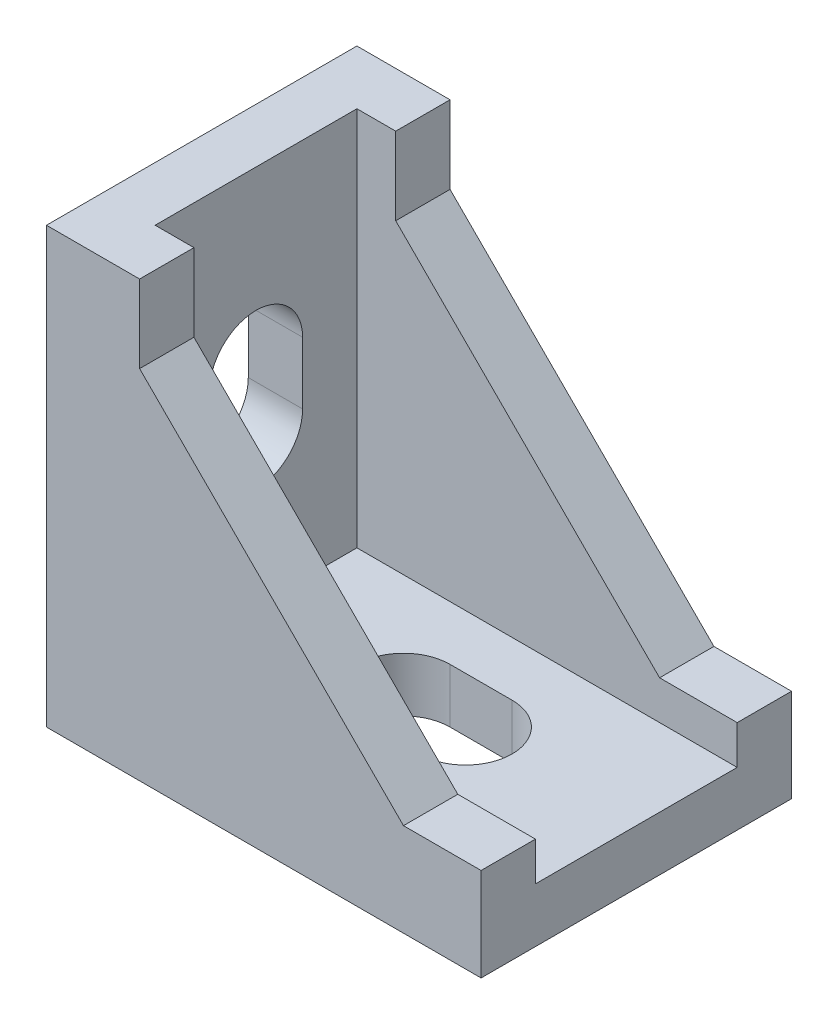
ISO-10303-21;
HEADER;
FILE_DESCRIPTION(('STEP AP214'),'2;1');
FILE_NAME('part.step','',(''),(''),'','','');
FILE_SCHEMA(('AUTOMOTIVE_DESIGN { 1 0 10303 214 1 1 1 1 }'));
ENDSEC;
DATA;
#1=APPLICATION_CONTEXT('core data for automotive mechanical design processes');
#2=APPLICATION_PROTOCOL_DEFINITION('international standard','automotive_design',2000,#1);
#3=PRODUCT_CONTEXT('',#1,'mechanical');
#4=PRODUCT('Part','Part','',(#3));
#5=PRODUCT_RELATED_PRODUCT_CATEGORY('part','',(#4));
#6=PRODUCT_DEFINITION_FORMATION('','',#4);
#7=PRODUCT_DEFINITION_CONTEXT('part definition',#1,'design');
#8=PRODUCT_DEFINITION('design','',#6,#7);
#9=PRODUCT_DEFINITION_SHAPE('','',#8);
#10=(LENGTH_UNIT() NAMED_UNIT(*) SI_UNIT(.MILLI.,.METRE.));
#11=(NAMED_UNIT(*) PLANE_ANGLE_UNIT() SI_UNIT($,.RADIAN.));
#12=(NAMED_UNIT(*) SI_UNIT($,.STERADIAN.) SOLID_ANGLE_UNIT());
#13=UNCERTAINTY_MEASURE_WITH_UNIT(LENGTH_MEASURE(1.E-05),#10,'distance_accuracy_value','');
#14=(GEOMETRIC_REPRESENTATION_CONTEXT(3) GLOBAL_UNCERTAINTY_ASSIGNED_CONTEXT((#13)) GLOBAL_UNIT_ASSIGNED_CONTEXT((#10,
#11,#12)) REPRESENTATION_CONTEXT('',''));
#15=CARTESIAN_POINT('',(0.,0.,0.));
#16=DIRECTION('',(0.,0.,1.));
#17=DIRECTION('',(1.,0.,0.));
#18=AXIS2_PLACEMENT_3D('',#15,#16,#17);
#19=CARTESIAN_POINT('',(3.5,28.,10.));
#20=DIRECTION('',(0.,-1.,0.));
#21=DIRECTION('',(0.,0.,-1.));
#22=AXIS2_PLACEMENT_3D('',#19,#20,#21);
#23=PLANE('',#22);
#24=DIRECTION('',(-1.,0.,0.));
#25=VECTOR('',#24,1.);
#26=CARTESIAN_POINT('',(3.5,28.,-10.));
#27=LINE('',#26,#25);
#28=CARTESIAN_POINT('',(6.,28.,-10.));
#29=VERTEX_POINT('',#28);
#30=CARTESIAN_POINT('',(0.,28.,-10.));
#31=VERTEX_POINT('',#30);
#32=EDGE_CURVE('E323',#29,#31,#27,.T.);
#33=ORIENTED_EDGE('',*,*,#32,.T.);
#34=DIRECTION('',(0.,0.,-1.));
#35=VECTOR('',#34,1.);
#36=CARTESIAN_POINT('',(0.,28.,10.));
#37=LINE('',#36,#35);
#38=CARTESIAN_POINT('',(0.,28.,10.));
#39=VERTEX_POINT('',#38);
#40=EDGE_CURVE('E12',#39,#31,#37,.T.);
#41=ORIENTED_EDGE('',*,*,#40,.F.);
#42=DIRECTION('',(-1.,0.,0.));
#43=VECTOR('',#42,1.);
#44=CARTESIAN_POINT('',(3.5,28.,10.));
#45=LINE('',#44,#43);
#46=CARTESIAN_POINT('',(6.,28.,10.));
#47=VERTEX_POINT('',#46);
#48=EDGE_CURVE('E330',#47,#39,#45,.T.);
#49=ORIENTED_EDGE('',*,*,#48,.F.);
#50=DIRECTION('',(0.,0.,1.));
#51=VECTOR('',#50,1.);
#52=CARTESIAN_POINT('',(6.,28.,6.5));
#53=LINE('',#52,#51);
#54=CARTESIAN_POINT('',(6.,28.,6.5));
#55=VERTEX_POINT('',#54);
#56=EDGE_CURVE('E320',#55,#47,#53,.T.);
#57=ORIENTED_EDGE('',*,*,#56,.F.);
#58=DIRECTION('',(-1.,0.,0.));
#59=VECTOR('',#58,1.);
#60=CARTESIAN_POINT('',(3.5,28.,6.5));
#61=LINE('',#60,#59);
#62=CARTESIAN_POINT('',(3.5,28.,6.5));
#63=VERTEX_POINT('',#62);
#64=EDGE_CURVE('E309',#55,#63,#61,.T.);
#65=ORIENTED_EDGE('',*,*,#64,.T.);
#66=DIRECTION('',(0.,0.,-1.));
#67=VECTOR('',#66,1.);
#68=CARTESIAN_POINT('',(3.5,28.,10.));
#69=LINE('',#68,#67);
#70=CARTESIAN_POINT('',(3.5,28.,-6.5));
#71=VERTEX_POINT('',#70);
#72=EDGE_CURVE('E340',#63,#71,#69,.T.);
#73=ORIENTED_EDGE('',*,*,#72,.T.);
#74=DIRECTION('',(-1.,0.,0.));
#75=VECTOR('',#74,1.);
#76=CARTESIAN_POINT('',(3.5,28.,-6.5));
#77=LINE('',#76,#75);
#78=CARTESIAN_POINT('',(6.,28.,-6.5));
#79=VERTEX_POINT('',#78);
#80=EDGE_CURVE('E257',#79,#71,#77,.T.);
#81=ORIENTED_EDGE('',*,*,#80,.F.);
#82=DIRECTION('',(0.,0.,-1.));
#83=VECTOR('',#82,1.);
#84=CARTESIAN_POINT('',(6.,28.,-6.5));
#85=LINE('',#84,#83);
#86=EDGE_CURVE('E272',#79,#29,#85,.T.);
#87=ORIENTED_EDGE('',*,*,#86,.T.);
#88=EDGE_LOOP('',(#33,#41,#49,#57,#65,#73,#81,#87));
#89=FACE_BOUND('',#88,.T.);
#90=ADVANCED_FACE('F38',(#89),#23,.F.);
#91=CARTESIAN_POINT('',(0.,28.,10.));
#92=DIRECTION('',(1.,0.,0.));
#93=DIRECTION('',(0.,1.,0.));
#94=AXIS2_PLACEMENT_3D('',#91,#92,#93);
#95=PLANE('',#94);
#96=DIRECTION('',(0.,1.,0.));
#97=VECTOR('',#96,1.);
#98=CARTESIAN_POINT('',(0.,13.,3.));
#99=LINE('',#98,#97);
#100=CARTESIAN_POINT('',(0.,13.,3.));
#101=VERTEX_POINT('',#100);
#102=CARTESIAN_POINT('',(0.,17.,3.));
#103=VERTEX_POINT('',#102);
#104=EDGE_CURVE('E206',#101,#103,#99,.T.);
#105=ORIENTED_EDGE('',*,*,#104,.F.);
#106=CARTESIAN_POINT('',(0.,13.,0.));
#107=DIRECTION('',(1.,0.,0.));
#108=DIRECTION('',(0.,1.,0.));
#109=AXIS2_PLACEMENT_3D('',#106,#107,#108);
#110=CIRCLE('',#109,3.);
#111=CARTESIAN_POINT('',(0.,13.,-3.));
#112=VERTEX_POINT('',#111);
#113=EDGE_CURVE('E188',#112,#101,#110,.F.);
#114=ORIENTED_EDGE('',*,*,#113,.F.);
#115=DIRECTION('',(0.,-1.,0.));
#116=VECTOR('',#115,1.);
#117=CARTESIAN_POINT('',(0.,13.,-3.));
#118=LINE('',#117,#116);
#119=CARTESIAN_POINT('',(0.,17.,-3.));
#120=VERTEX_POINT('',#119);
#121=EDGE_CURVE('E197',#120,#112,#118,.T.);
#122=ORIENTED_EDGE('',*,*,#121,.F.);
#123=CARTESIAN_POINT('',(0.,17.,0.));
#124=DIRECTION('',(1.,0.,0.));
#125=DIRECTION('',(0.,1.,0.));
#126=AXIS2_PLACEMENT_3D('',#123,#124,#125);
#127=CIRCLE('',#126,3.);
#128=EDGE_CURVE('E52',#103,#120,#127,.F.);
#129=ORIENTED_EDGE('',*,*,#128,.F.);
#130=EDGE_LOOP('',(#105,#114,#122,#129));
#131=FACE_BOUND('',#130,.T.);
#132=DIRECTION('',(0.,-1.,0.));
#133=VECTOR('',#132,1.);
#134=CARTESIAN_POINT('',(0.,28.,-10.));
#135=LINE('',#134,#133);
#136=CARTESIAN_POINT('',(0.,0.,-10.));
#137=VERTEX_POINT('',#136);
#138=EDGE_CURVE('E343',#31,#137,#135,.T.);
#139=ORIENTED_EDGE('',*,*,#138,.T.);
#140=DIRECTION('',(0.,0.,-1.));
#141=VECTOR('',#140,1.);
#142=CARTESIAN_POINT('',(0.,0.,10.));
#143=LINE('',#142,#141);
#144=CARTESIAN_POINT('',(0.,0.,10.));
#145=VERTEX_POINT('',#144);
#146=EDGE_CURVE('E45',#145,#137,#143,.T.);
#147=ORIENTED_EDGE('',*,*,#146,.F.);
#148=DIRECTION('',(0.,-1.,0.));
#149=VECTOR('',#148,1.);
#150=CARTESIAN_POINT('',(0.,28.,10.));
#151=LINE('',#150,#149);
#152=EDGE_CURVE('E333',#39,#145,#151,.T.);
#153=ORIENTED_EDGE('',*,*,#152,.F.);
#154=ORIENTED_EDGE('',*,*,#40,.T.);
#155=EDGE_LOOP('',(#139,#147,#153,#154));
#156=FACE_BOUND('',#155,.T.);
#157=ADVANCED_FACE('F203',(#131,#156),#95,.F.);
#158=CARTESIAN_POINT('',(0.,0.,10.));
#159=DIRECTION('',(0.,1.,0.));
#160=DIRECTION('',(0.,0.,1.));
#161=AXIS2_PLACEMENT_3D('',#158,#159,#160);
#162=PLANE('',#161);
#163=DIRECTION('',(1.,0.,0.));
#164=VECTOR('',#163,1.);
#165=CARTESIAN_POINT('',(13.,0.,-3.));
#166=LINE('',#165,#164);
#167=CARTESIAN_POINT('',(13.,0.,-3.));
#168=VERTEX_POINT('',#167);
#169=CARTESIAN_POINT('',(17.,0.,-3.));
#170=VERTEX_POINT('',#169);
#171=EDGE_CURVE('E224',#168,#170,#166,.T.);
#172=ORIENTED_EDGE('',*,*,#171,.F.);
#173=CARTESIAN_POINT('',(13.,0.,0.));
#174=DIRECTION('',(0.,1.,0.));
#175=DIRECTION('',(0.,0.,1.));
#176=AXIS2_PLACEMENT_3D('',#173,#174,#175);
#177=CIRCLE('',#176,3.);
#178=CARTESIAN_POINT('',(13.,0.,3.));
#179=VERTEX_POINT('',#178);
#180=EDGE_CURVE('E227',#179,#168,#177,.F.);
#181=ORIENTED_EDGE('',*,*,#180,.F.);
#182=DIRECTION('',(-1.,0.,0.));
#183=VECTOR('',#182,1.);
#184=CARTESIAN_POINT('',(13.,0.,3.));
#185=LINE('',#184,#183);
#186=CARTESIAN_POINT('',(17.,0.,3.));
#187=VERTEX_POINT('',#186);
#188=EDGE_CURVE('E244',#187,#179,#185,.T.);
#189=ORIENTED_EDGE('',*,*,#188,.F.);
#190=CARTESIAN_POINT('',(17.,0.,0.));
#191=DIRECTION('',(0.,1.,0.));
#192=DIRECTION('',(0.,0.,1.));
#193=AXIS2_PLACEMENT_3D('',#190,#191,#192);
#194=CIRCLE('',#193,3.);
#195=EDGE_CURVE('E200',#170,#187,#194,.F.);
#196=ORIENTED_EDGE('',*,*,#195,.F.);
#197=EDGE_LOOP('',(#172,#181,#189,#196));
#198=FACE_BOUND('',#197,.T.);
#199=DIRECTION('',(1.,0.,0.));
#200=VECTOR('',#199,1.);
#201=CARTESIAN_POINT('',(0.,0.,-10.));
#202=LINE('',#201,#200);
#203=CARTESIAN_POINT('',(28.,0.,-10.));
#204=VERTEX_POINT('',#203);
#205=EDGE_CURVE('E345',#137,#204,#202,.T.);
#206=ORIENTED_EDGE('',*,*,#205,.T.);
#207=DIRECTION('',(0.,0.,-1.));
#208=VECTOR('',#207,1.);
#209=CARTESIAN_POINT('',(28.,0.,10.));
#210=LINE('',#209,#208);
#211=CARTESIAN_POINT('',(28.,0.,10.));
#212=VERTEX_POINT('',#211);
#213=EDGE_CURVE('E355',#212,#204,#210,.T.);
#214=ORIENTED_EDGE('',*,*,#213,.F.);
#215=DIRECTION('',(1.,0.,0.));
#216=VECTOR('',#215,1.);
#217=CARTESIAN_POINT('',(0.,0.,10.));
#218=LINE('',#217,#216);
#219=EDGE_CURVE('E336',#145,#212,#218,.T.);
#220=ORIENTED_EDGE('',*,*,#219,.F.);
#221=ORIENTED_EDGE('',*,*,#146,.T.);
#222=EDGE_LOOP('',(#206,#214,#220,#221));
#223=FACE_BOUND('',#222,.T.);
#224=ADVANCED_FACE('F362',(#198,#223),#162,.F.);
#225=CARTESIAN_POINT('',(28.,0.,10.));
#226=DIRECTION('',(-1.,0.,0.));
#227=DIRECTION('',(0.,0.,1.));
#228=AXIS2_PLACEMENT_3D('',#225,#226,#227);
#229=PLANE('',#228);
#230=DIRECTION('',(0.,1.,0.));
#231=VECTOR('',#230,1.);
#232=CARTESIAN_POINT('',(28.,0.,-10.));
#233=LINE('',#232,#231);
#234=CARTESIAN_POINT('',(28.,6.,-10.));
#235=VERTEX_POINT('',#234);
#236=EDGE_CURVE('E334',#204,#235,#233,.T.);
#237=ORIENTED_EDGE('',*,*,#236,.T.);
#238=DIRECTION('',(0.,0.,-1.));
#239=VECTOR('',#238,1.);
#240=CARTESIAN_POINT('',(28.,6.,-6.5));
#241=LINE('',#240,#239);
#242=CARTESIAN_POINT('',(28.,6.,-6.5));
#243=VERTEX_POINT('',#242);
#244=EDGE_CURVE('E278',#243,#235,#241,.T.);
#245=ORIENTED_EDGE('',*,*,#244,.F.);
#246=DIRECTION('',(0.,1.,0.));
#247=VECTOR('',#246,1.);
#248=CARTESIAN_POINT('',(28.,6.,-6.5));
#249=LINE('',#248,#247);
#250=CARTESIAN_POINT('',(28.,3.5,-6.5));
#251=VERTEX_POINT('',#250);
#252=EDGE_CURVE('E267',#251,#243,#249,.T.);
#253=ORIENTED_EDGE('',*,*,#252,.F.);
#254=DIRECTION('',(0.,0.,-1.));
#255=VECTOR('',#254,1.);
#256=CARTESIAN_POINT('',(28.,3.5,10.));
#257=LINE('',#256,#255);
#258=CARTESIAN_POINT('',(28.,3.5,6.5));
#259=VERTEX_POINT('',#258);
#260=EDGE_CURVE('E353',#259,#251,#257,.T.);
#261=ORIENTED_EDGE('',*,*,#260,.F.);
#262=DIRECTION('',(0.,1.,0.));
#263=VECTOR('',#262,1.);
#264=CARTESIAN_POINT('',(28.,6.,6.5));
#265=LINE('',#264,#263);
#266=CARTESIAN_POINT('',(28.,6.,6.5));
#267=VERTEX_POINT('',#266);
#268=EDGE_CURVE('E297',#259,#267,#265,.T.);
#269=ORIENTED_EDGE('',*,*,#268,.T.);
#270=DIRECTION('',(0.,0.,1.));
#271=VECTOR('',#270,1.);
#272=CARTESIAN_POINT('',(28.,6.,6.5));
#273=LINE('',#272,#271);
#274=CARTESIAN_POINT('',(28.,6.,10.));
#275=VERTEX_POINT('',#274);
#276=EDGE_CURVE('E312',#267,#275,#273,.T.);
#277=ORIENTED_EDGE('',*,*,#276,.T.);
#278=DIRECTION('',(0.,1.,0.));
#279=VECTOR('',#278,1.);
#280=CARTESIAN_POINT('',(28.,0.,10.));
#281=LINE('',#280,#279);
#282=EDGE_CURVE('E338',#212,#275,#281,.T.);
#283=ORIENTED_EDGE('',*,*,#282,.F.);
#284=ORIENTED_EDGE('',*,*,#213,.T.);
#285=EDGE_LOOP('',(#237,#245,#253,#261,#269,#277,#283,#284));
#286=FACE_BOUND('',#285,.T.);
#287=ADVANCED_FACE('F371',(#286),#229,.F.);
#288=CARTESIAN_POINT('',(28.,3.5,10.));
#289=DIRECTION('',(0.,-1.,0.));
#290=DIRECTION('',(1.,0.,0.));
#291=AXIS2_PLACEMENT_3D('',#288,#289,#290);
#292=PLANE('',#291);
#293=DIRECTION('',(1.,0.,0.));
#294=VECTOR('',#293,1.);
#295=CARTESIAN_POINT('',(13.,3.5,3.));
#296=LINE('',#295,#294);
#297=CARTESIAN_POINT('',(13.,3.5,3.));
#298=VERTEX_POINT('',#297);
#299=CARTESIAN_POINT('',(17.,3.5,3.));
#300=VERTEX_POINT('',#299);
#301=EDGE_CURVE('E232',#298,#300,#296,.T.);
#302=ORIENTED_EDGE('',*,*,#301,.F.);
#303=CARTESIAN_POINT('',(13.,3.5,0.));
#304=DIRECTION('',(0.,1.,0.));
#305=DIRECTION('',(-1.,0.,0.));
#306=AXIS2_PLACEMENT_3D('',#303,#304,#305);
#307=CIRCLE('',#306,3.);
#308=CARTESIAN_POINT('',(13.,3.5,-3.));
#309=VERTEX_POINT('',#308);
#310=EDGE_CURVE('E230',#309,#298,#307,.T.);
#311=ORIENTED_EDGE('',*,*,#310,.F.);
#312=DIRECTION('',(-1.,0.,0.));
#313=VECTOR('',#312,1.);
#314=CARTESIAN_POINT('',(13.,3.5,-3.));
#315=LINE('',#314,#313);
#316=CARTESIAN_POINT('',(17.,3.5,-3.));
#317=VERTEX_POINT('',#316);
#318=EDGE_CURVE('E238',#317,#309,#315,.T.);
#319=ORIENTED_EDGE('',*,*,#318,.F.);
#320=CARTESIAN_POINT('',(17.,3.5,0.));
#321=DIRECTION('',(0.,1.,0.));
#322=DIRECTION('',(-1.,0.,0.));
#323=AXIS2_PLACEMENT_3D('',#320,#321,#322);
#324=CIRCLE('',#323,3.);
#325=EDGE_CURVE('E235',#300,#317,#324,.T.);
#326=ORIENTED_EDGE('',*,*,#325,.F.);
#327=EDGE_LOOP('',(#302,#311,#319,#326));
#328=FACE_BOUND('',#327,.T.);
#329=ORIENTED_EDGE('',*,*,#260,.T.);
#330=DIRECTION('',(1.,0.,0.));
#331=VECTOR('',#330,1.);
#332=CARTESIAN_POINT('',(28.,3.5,-6.5));
#333=LINE('',#332,#331);
#334=CARTESIAN_POINT('',(3.5,3.5,-6.5));
#335=VERTEX_POINT('',#334);
#336=EDGE_CURVE('E269',#335,#251,#333,.T.);
#337=ORIENTED_EDGE('',*,*,#336,.F.);
#338=DIRECTION('',(0.,0.,-1.));
#339=VECTOR('',#338,1.);
#340=CARTESIAN_POINT('',(3.5,3.5,10.));
#341=LINE('',#340,#339);
#342=CARTESIAN_POINT('',(3.5,3.5,6.5));
#343=VERTEX_POINT('',#342);
#344=EDGE_CURVE('E350',#343,#335,#341,.T.);
#345=ORIENTED_EDGE('',*,*,#344,.F.);
#346=DIRECTION('',(1.,0.,0.));
#347=VECTOR('',#346,1.);
#348=CARTESIAN_POINT('',(28.,3.5,6.5));
#349=LINE('',#348,#347);
#350=EDGE_CURVE('E293',#343,#259,#349,.T.);
#351=ORIENTED_EDGE('',*,*,#350,.T.);
#352=EDGE_LOOP('',(#329,#337,#345,#351));
#353=FACE_BOUND('',#352,.T.);
#354=ADVANCED_FACE('F384',(#328,#353),#292,.F.);
#355=CARTESIAN_POINT('',(3.5,3.5,10.));
#356=DIRECTION('',(-1.,0.,0.));
#357=DIRECTION('',(0.,-1.,0.));
#358=AXIS2_PLACEMENT_3D('',#355,#356,#357);
#359=PLANE('',#358);
#360=DIRECTION('',(0.,1.,0.));
#361=VECTOR('',#360,1.);
#362=CARTESIAN_POINT('',(3.5,13.,-3.));
#363=LINE('',#362,#361);
#364=CARTESIAN_POINT('',(3.5,13.,-3.));
#365=VERTEX_POINT('',#364);
#366=CARTESIAN_POINT('',(3.5,17.,-3.));
#367=VERTEX_POINT('',#366);
#368=EDGE_CURVE('E208',#365,#367,#363,.T.);
#369=ORIENTED_EDGE('',*,*,#368,.F.);
#370=CARTESIAN_POINT('',(3.5,13.,0.));
#371=DIRECTION('',(1.,0.,0.));
#372=DIRECTION('',(0.,1.,0.));
#373=AXIS2_PLACEMENT_3D('',#370,#371,#372);
#374=CIRCLE('',#373,3.);
#375=CARTESIAN_POINT('',(3.5,13.,3.));
#376=VERTEX_POINT('',#375);
#377=EDGE_CURVE('E60',#376,#365,#374,.T.);
#378=ORIENTED_EDGE('',*,*,#377,.F.);
#379=DIRECTION('',(0.,-1.,0.));
#380=VECTOR('',#379,1.);
#381=CARTESIAN_POINT('',(3.5,13.,3.));
#382=LINE('',#381,#380);
#383=CARTESIAN_POINT('',(3.5,17.,3.));
#384=VERTEX_POINT('',#383);
#385=EDGE_CURVE('E194',#384,#376,#382,.T.);
#386=ORIENTED_EDGE('',*,*,#385,.F.);
#387=CARTESIAN_POINT('',(3.5,17.,0.));
#388=DIRECTION('',(1.,0.,0.));
#389=DIRECTION('',(0.,1.,0.));
#390=AXIS2_PLACEMENT_3D('',#387,#388,#389);
#391=CIRCLE('',#390,3.);
#392=EDGE_CURVE('E214',#367,#384,#391,.T.);
#393=ORIENTED_EDGE('',*,*,#392,.F.);
#394=EDGE_LOOP('',(#369,#378,#386,#393));
#395=FACE_BOUND('',#394,.T.);
#396=ORIENTED_EDGE('',*,*,#344,.T.);
#397=DIRECTION('',(0.,-1.,0.));
#398=VECTOR('',#397,1.);
#399=CARTESIAN_POINT('',(3.5,3.5,-6.5));
#400=LINE('',#399,#398);
#401=EDGE_CURVE('E254',#71,#335,#400,.T.);
#402=ORIENTED_EDGE('',*,*,#401,.F.);
#403=ORIENTED_EDGE('',*,*,#72,.F.);
#404=DIRECTION('',(0.,-1.,0.));
#405=VECTOR('',#404,1.);
#406=CARTESIAN_POINT('',(3.5,3.5,6.5));
#407=LINE('',#406,#405);
#408=EDGE_CURVE('E289',#63,#343,#407,.T.);
#409=ORIENTED_EDGE('',*,*,#408,.T.);
#410=EDGE_LOOP('',(#396,#402,#403,#409));
#411=FACE_BOUND('',#410,.T.);
#412=ADVANCED_FACE('F392',(#395,#411),#359,.F.);
#413=CARTESIAN_POINT('',(0.,0.,10.));
#414=DIRECTION('',(0.,0.,1.));
#415=DIRECTION('',(1.,0.,0.));
#416=AXIS2_PLACEMENT_3D('',#413,#414,#415);
#417=PLANE('',#416);
#418=DIRECTION('',(0.,1.,0.));
#419=VECTOR('',#418,1.);
#420=CARTESIAN_POINT('',(6.,28.,10.));
#421=LINE('',#420,#419);
#422=CARTESIAN_POINT('',(6.,23.,10.));
#423=VERTEX_POINT('',#422);
#424=EDGE_CURVE('E294',#423,#47,#421,.T.);
#425=ORIENTED_EDGE('',*,*,#424,.T.);
#426=ORIENTED_EDGE('',*,*,#48,.T.);
#427=ORIENTED_EDGE('',*,*,#152,.T.);
#428=ORIENTED_EDGE('',*,*,#219,.T.);
#429=ORIENTED_EDGE('',*,*,#282,.T.);
#430=DIRECTION('',(-1.,0.,0.));
#431=VECTOR('',#430,1.);
#432=CARTESIAN_POINT('',(23.,6.,10.));
#433=LINE('',#432,#431);
#434=CARTESIAN_POINT('',(23.,6.,10.));
#435=VERTEX_POINT('',#434);
#436=EDGE_CURVE('E281',#275,#435,#433,.T.);
#437=ORIENTED_EDGE('',*,*,#436,.T.);
#438=DIRECTION('',(-0.707106781186547,0.707106781186548,0.));
#439=VECTOR('',#438,1.);
#440=CARTESIAN_POINT('',(6.,23.,10.));
#441=LINE('',#440,#439);
#442=EDGE_CURVE('E315',#435,#423,#441,.T.);
#443=ORIENTED_EDGE('',*,*,#442,.T.);
#444=EDGE_LOOP('',(#425,#426,#427,#428,#429,#437,#443));
#445=FACE_BOUND('',#444,.T.);
#446=ADVANCED_FACE('F428',(#445),#417,.T.);
#447=CARTESIAN_POINT('',(0.,0.,-10.));
#448=DIRECTION('',(0.,0.,1.));
#449=DIRECTION('',(1.,0.,0.));
#450=AXIS2_PLACEMENT_3D('',#447,#448,#449);
#451=PLANE('',#450);
#452=ORIENTED_EDGE('',*,*,#32,.F.);
#453=DIRECTION('',(0.,1.,0.));
#454=VECTOR('',#453,1.);
#455=CARTESIAN_POINT('',(6.,28.,-10.));
#456=LINE('',#455,#454);
#457=CARTESIAN_POINT('',(6.,23.,-10.));
#458=VERTEX_POINT('',#457);
#459=EDGE_CURVE('E253',#458,#29,#456,.T.);
#460=ORIENTED_EDGE('',*,*,#459,.F.);
#461=DIRECTION('',(-0.707106781186547,0.707106781186548,0.));
#462=VECTOR('',#461,1.);
#463=CARTESIAN_POINT('',(6.,23.,-10.));
#464=LINE('',#463,#462);
#465=CARTESIAN_POINT('',(23.,6.,-10.));
#466=VERTEX_POINT('',#465);
#467=EDGE_CURVE('E275',#466,#458,#464,.T.);
#468=ORIENTED_EDGE('',*,*,#467,.F.);
#469=DIRECTION('',(-1.,0.,0.));
#470=VECTOR('',#469,1.);
#471=CARTESIAN_POINT('',(23.,6.,-10.));
#472=LINE('',#471,#470);
#473=EDGE_CURVE('E258',#235,#466,#472,.T.);
#474=ORIENTED_EDGE('',*,*,#473,.F.);
#475=ORIENTED_EDGE('',*,*,#236,.F.);
#476=ORIENTED_EDGE('',*,*,#205,.F.);
#477=ORIENTED_EDGE('',*,*,#138,.F.);
#478=EDGE_LOOP('',(#452,#460,#468,#474,#475,#476,#477));
#479=FACE_BOUND('',#478,.T.);
#480=ADVANCED_FACE('F366',(#479),#451,.F.);
#481=CARTESIAN_POINT('',(6.,28.,6.5));
#482=DIRECTION('',(1.,0.,0.));
#483=DIRECTION('',(0.,1.,0.));
#484=AXIS2_PLACEMENT_3D('',#481,#482,#483);
#485=PLANE('',#484);
#486=ORIENTED_EDGE('',*,*,#424,.F.);
#487=DIRECTION('',(0.,0.,1.));
#488=VECTOR('',#487,1.);
#489=CARTESIAN_POINT('',(6.,23.,6.5));
#490=LINE('',#489,#488);
#491=CARTESIAN_POINT('',(6.,23.,6.5));
#492=VERTEX_POINT('',#491);
#493=EDGE_CURVE('E324',#492,#423,#490,.T.);
#494=ORIENTED_EDGE('',*,*,#493,.F.);
#495=DIRECTION('',(0.,1.,0.));
#496=VECTOR('',#495,1.);
#497=CARTESIAN_POINT('',(6.,28.,6.5));
#498=LINE('',#497,#496);
#499=EDGE_CURVE('E306',#492,#55,#498,.T.);
#500=ORIENTED_EDGE('',*,*,#499,.T.);
#501=ORIENTED_EDGE('',*,*,#56,.T.);
#502=EDGE_LOOP('',(#486,#494,#500,#501));
#503=FACE_BOUND('',#502,.T.);
#504=ADVANCED_FACE('F432',(#503),#485,.T.);
#505=CARTESIAN_POINT('',(6.,23.,6.5));
#506=DIRECTION('',(0.707106781186548,0.707106781186548,0.));
#507=DIRECTION('',(-0.707106781186547,0.707106781186548,0.));
#508=AXIS2_PLACEMENT_3D('',#505,#506,#507);
#509=PLANE('',#508);
#510=ORIENTED_EDGE('',*,*,#442,.F.);
#511=DIRECTION('',(0.,0.,1.));
#512=VECTOR('',#511,1.);
#513=CARTESIAN_POINT('',(23.,6.,6.5));
#514=LINE('',#513,#512);
#515=CARTESIAN_POINT('',(23.,6.,6.5));
#516=VERTEX_POINT('',#515);
#517=EDGE_CURVE('E326',#516,#435,#514,.T.);
#518=ORIENTED_EDGE('',*,*,#517,.F.);
#519=DIRECTION('',(-0.707106781186547,0.707106781186548,0.));
#520=VECTOR('',#519,1.);
#521=CARTESIAN_POINT('',(6.,23.,6.5));
#522=LINE('',#521,#520);
#523=EDGE_CURVE('E303',#516,#492,#522,.T.);
#524=ORIENTED_EDGE('',*,*,#523,.T.);
#525=ORIENTED_EDGE('',*,*,#493,.T.);
#526=EDGE_LOOP('',(#510,#518,#524,#525));
#527=FACE_BOUND('',#526,.T.);
#528=ADVANCED_FACE('F439',(#527),#509,.T.);
#529=CARTESIAN_POINT('',(23.,6.,6.5));
#530=DIRECTION('',(0.,1.,0.));
#531=DIRECTION('',(0.,0.,1.));
#532=AXIS2_PLACEMENT_3D('',#529,#530,#531);
#533=PLANE('',#532);
#534=ORIENTED_EDGE('',*,*,#436,.F.);
#535=ORIENTED_EDGE('',*,*,#276,.F.);
#536=DIRECTION('',(-1.,0.,0.));
#537=VECTOR('',#536,1.);
#538=CARTESIAN_POINT('',(23.,6.,6.5));
#539=LINE('',#538,#537);
#540=EDGE_CURVE('E300',#267,#516,#539,.T.);
#541=ORIENTED_EDGE('',*,*,#540,.T.);
#542=ORIENTED_EDGE('',*,*,#517,.T.);
#543=EDGE_LOOP('',(#534,#535,#541,#542));
#544=FACE_BOUND('',#543,.T.);
#545=ADVANCED_FACE('F436',(#544),#533,.T.);
#546=CARTESIAN_POINT('',(0.,0.,6.5));
#547=DIRECTION('',(0.,0.,-1.));
#548=DIRECTION('',(-1.,0.,0.));
#549=AXIS2_PLACEMENT_3D('',#546,#547,#548);
#550=PLANE('',#549);
#551=ORIENTED_EDGE('',*,*,#408,.F.);
#552=ORIENTED_EDGE('',*,*,#64,.F.);
#553=ORIENTED_EDGE('',*,*,#499,.F.);
#554=ORIENTED_EDGE('',*,*,#523,.F.);
#555=ORIENTED_EDGE('',*,*,#540,.F.);
#556=ORIENTED_EDGE('',*,*,#268,.F.);
#557=ORIENTED_EDGE('',*,*,#350,.F.);
#558=EDGE_LOOP('',(#551,#552,#553,#554,#555,#556,#557));
#559=FACE_BOUND('',#558,.T.);
#560=ADVANCED_FACE('F387',(#559),#550,.T.);
#561=CARTESIAN_POINT('',(23.,6.,-6.5));
#562=DIRECTION('',(0.,-1.,0.));
#563=DIRECTION('',(0.,0.,-1.));
#564=AXIS2_PLACEMENT_3D('',#561,#562,#563);
#565=PLANE('',#564);
#566=ORIENTED_EDGE('',*,*,#473,.T.);
#567=DIRECTION('',(0.,0.,-1.));
#568=VECTOR('',#567,1.);
#569=CARTESIAN_POINT('',(23.,6.,-6.5));
#570=LINE('',#569,#568);
#571=CARTESIAN_POINT('',(23.,6.,-6.5));
#572=VERTEX_POINT('',#571);
#573=EDGE_CURVE('E282',#572,#466,#570,.T.);
#574=ORIENTED_EDGE('',*,*,#573,.F.);
#575=DIRECTION('',(-1.,0.,0.));
#576=VECTOR('',#575,1.);
#577=CARTESIAN_POINT('',(23.,6.,-6.5));
#578=LINE('',#577,#576);
#579=EDGE_CURVE('E265',#243,#572,#578,.T.);
#580=ORIENTED_EDGE('',*,*,#579,.F.);
#581=ORIENTED_EDGE('',*,*,#244,.T.);
#582=EDGE_LOOP('',(#566,#574,#580,#581));
#583=FACE_BOUND('',#582,.T.);
#584=ADVANCED_FACE('F376',(#583),#565,.F.);
#585=CARTESIAN_POINT('',(6.,23.,-6.5));
#586=DIRECTION('',(-0.707106781186548,-0.707106781186548,0.));
#587=DIRECTION('',(0.707106781186547,-0.707106781186548,0.));
#588=AXIS2_PLACEMENT_3D('',#585,#586,#587);
#589=PLANE('',#588);
#590=ORIENTED_EDGE('',*,*,#467,.T.);
#591=DIRECTION('',(0.,0.,-1.));
#592=VECTOR('',#591,1.);
#593=CARTESIAN_POINT('',(6.,23.,-6.5));
#594=LINE('',#593,#592);
#595=CARTESIAN_POINT('',(6.,23.,-6.5));
#596=VERTEX_POINT('',#595);
#597=EDGE_CURVE('E285',#596,#458,#594,.T.);
#598=ORIENTED_EDGE('',*,*,#597,.F.);
#599=DIRECTION('',(-0.707106781186547,0.707106781186548,0.));
#600=VECTOR('',#599,1.);
#601=CARTESIAN_POINT('',(6.,23.,-6.5));
#602=LINE('',#601,#600);
#603=EDGE_CURVE('E263',#572,#596,#602,.T.);
#604=ORIENTED_EDGE('',*,*,#603,.F.);
#605=ORIENTED_EDGE('',*,*,#573,.T.);
#606=EDGE_LOOP('',(#590,#598,#604,#605));
#607=FACE_BOUND('',#606,.T.);
#608=ADVANCED_FACE('F402',(#607),#589,.F.);
#609=CARTESIAN_POINT('',(6.,28.,-6.5));
#610=DIRECTION('',(-1.,0.,0.));
#611=DIRECTION('',(0.,-1.,0.));
#612=AXIS2_PLACEMENT_3D('',#609,#610,#611);
#613=PLANE('',#612);
#614=ORIENTED_EDGE('',*,*,#459,.T.);
#615=ORIENTED_EDGE('',*,*,#86,.F.);
#616=DIRECTION('',(0.,1.,0.));
#617=VECTOR('',#616,1.);
#618=CARTESIAN_POINT('',(6.,28.,-6.5));
#619=LINE('',#618,#617);
#620=EDGE_CURVE('E261',#596,#79,#619,.T.);
#621=ORIENTED_EDGE('',*,*,#620,.F.);
#622=ORIENTED_EDGE('',*,*,#597,.T.);
#623=EDGE_LOOP('',(#614,#615,#621,#622));
#624=FACE_BOUND('',#623,.T.);
#625=ADVANCED_FACE('F398',(#624),#613,.F.);
#626=CARTESIAN_POINT('',(0.,0.,-6.5));
#627=DIRECTION('',(0.,0.,1.));
#628=DIRECTION('',(-1.,0.,0.));
#629=AXIS2_PLACEMENT_3D('',#626,#627,#628);
#630=PLANE('',#629);
#631=ORIENTED_EDGE('',*,*,#401,.T.);
#632=ORIENTED_EDGE('',*,*,#336,.T.);
#633=ORIENTED_EDGE('',*,*,#252,.T.);
#634=ORIENTED_EDGE('',*,*,#579,.T.);
#635=ORIENTED_EDGE('',*,*,#603,.T.);
#636=ORIENTED_EDGE('',*,*,#620,.T.);
#637=ORIENTED_EDGE('',*,*,#80,.T.);
#638=EDGE_LOOP('',(#631,#632,#633,#634,#635,#636,#637));
#639=FACE_BOUND('',#638,.T.);
#640=ADVANCED_FACE('F380',(#639),#630,.T.);
#641=CARTESIAN_POINT('',(13.,-0.00100000000000273,0.));
#642=DIRECTION('',(0.,1.,0.));
#643=DIRECTION('',(-1.,0.,0.));
#644=AXIS2_PLACEMENT_3D('',#641,#642,#643);
#645=CYLINDRICAL_SURFACE('',#644,3.);
#646=ORIENTED_EDGE('',*,*,#180,.T.);
#647=DIRECTION('',(0.,1.,0.));
#648=VECTOR('',#647,1.);
#649=CARTESIAN_POINT('',(13.,-0.00100000000000273,-3.));
#650=LINE('',#649,#648);
#651=EDGE_CURVE('E242',#168,#309,#650,.T.);
#652=ORIENTED_EDGE('',*,*,#651,.T.);
#653=ORIENTED_EDGE('',*,*,#310,.T.);
#654=DIRECTION('',(0.,1.,0.));
#655=VECTOR('',#654,1.);
#656=CARTESIAN_POINT('',(13.,-0.00100000000000273,3.));
#657=LINE('',#656,#655);
#658=EDGE_CURVE('E241',#179,#298,#657,.T.);
#659=ORIENTED_EDGE('',*,*,#658,.F.);
#660=EDGE_LOOP('',(#646,#652,#653,#659));
#661=FACE_BOUND('',#660,.T.);
#662=ADVANCED_FACE('F477',(#661),#645,.F.);
#663=CARTESIAN_POINT('',(13.,-0.00100000000000273,-3.));
#664=DIRECTION('',(0.,0.,-1.));
#665=DIRECTION('',(-1.,0.,0.));
#666=AXIS2_PLACEMENT_3D('',#663,#664,#665);
#667=PLANE('',#666);
#668=ORIENTED_EDGE('',*,*,#171,.T.);
#669=DIRECTION('',(0.,1.,0.));
#670=VECTOR('',#669,1.);
#671=CARTESIAN_POINT('',(17.,-0.00100000000000187,-3.));
#672=LINE('',#671,#670);
#673=EDGE_CURVE('E245',#170,#317,#672,.T.);
#674=ORIENTED_EDGE('',*,*,#673,.T.);
#675=ORIENTED_EDGE('',*,*,#318,.T.);
#676=ORIENTED_EDGE('',*,*,#651,.F.);
#677=EDGE_LOOP('',(#668,#674,#675,#676));
#678=FACE_BOUND('',#677,.T.);
#679=ADVANCED_FACE('F482',(#678),#667,.F.);
#680=CARTESIAN_POINT('',(17.,-0.00100000000000187,0.));
#681=DIRECTION('',(0.,1.,0.));
#682=DIRECTION('',(-1.,0.,0.));
#683=AXIS2_PLACEMENT_3D('',#680,#681,#682);
#684=CYLINDRICAL_SURFACE('',#683,3.);
#685=ORIENTED_EDGE('',*,*,#195,.T.);
#686=DIRECTION('',(0.,1.,0.));
#687=VECTOR('',#686,1.);
#688=CARTESIAN_POINT('',(17.,-0.00100000000000187,3.));
#689=LINE('',#688,#687);
#690=EDGE_CURVE('E247',#187,#300,#689,.T.);
#691=ORIENTED_EDGE('',*,*,#690,.T.);
#692=ORIENTED_EDGE('',*,*,#325,.T.);
#693=ORIENTED_EDGE('',*,*,#673,.F.);
#694=EDGE_LOOP('',(#685,#691,#692,#693));
#695=FACE_BOUND('',#694,.T.);
#696=ADVANCED_FACE('F491',(#695),#684,.F.);
#697=CARTESIAN_POINT('',(13.,-0.00100000000000273,3.));
#698=DIRECTION('',(0.,0.,1.));
#699=DIRECTION('',(1.,0.,0.));
#700=AXIS2_PLACEMENT_3D('',#697,#698,#699);
#701=PLANE('',#700);
#702=ORIENTED_EDGE('',*,*,#188,.T.);
#703=ORIENTED_EDGE('',*,*,#658,.T.);
#704=ORIENTED_EDGE('',*,*,#301,.T.);
#705=ORIENTED_EDGE('',*,*,#690,.F.);
#706=EDGE_LOOP('',(#702,#703,#704,#705));
#707=FACE_BOUND('',#706,.T.);
#708=ADVANCED_FACE('F499',(#707),#701,.F.);
#709=CARTESIAN_POINT('',(-0.00100000000000013,13.,0.));
#710=DIRECTION('',(1.,0.,0.));
#711=DIRECTION('',(0.,1.,0.));
#712=AXIS2_PLACEMENT_3D('',#709,#710,#711);
#713=CYLINDRICAL_SURFACE('',#712,3.);
#714=ORIENTED_EDGE('',*,*,#113,.T.);
#715=DIRECTION('',(1.,0.,0.));
#716=VECTOR('',#715,1.);
#717=CARTESIAN_POINT('',(-0.00100000000000013,13.,3.));
#718=LINE('',#717,#716);
#719=EDGE_CURVE('E201',#101,#376,#718,.T.);
#720=ORIENTED_EDGE('',*,*,#719,.T.);
#721=ORIENTED_EDGE('',*,*,#377,.T.);
#722=DIRECTION('',(1.,0.,0.));
#723=VECTOR('',#722,1.);
#724=CARTESIAN_POINT('',(-0.00100000000000013,13.,-3.));
#725=LINE('',#724,#723);
#726=EDGE_CURVE('E184',#112,#365,#725,.T.);
#727=ORIENTED_EDGE('',*,*,#726,.F.);
#728=EDGE_LOOP('',(#714,#720,#721,#727));
#729=FACE_BOUND('',#728,.T.);
#730=ADVANCED_FACE('F186',(#729),#713,.F.);
#731=CARTESIAN_POINT('',(-0.00100000000000013,13.,3.));
#732=DIRECTION('',(0.,0.,1.));
#733=DIRECTION('',(1.,0.,0.));
#734=AXIS2_PLACEMENT_3D('',#731,#732,#733);
#735=PLANE('',#734);
#736=ORIENTED_EDGE('',*,*,#104,.T.);
#737=DIRECTION('',(1.,0.,0.));
#738=VECTOR('',#737,1.);
#739=CARTESIAN_POINT('',(-0.00100000000000013,17.,3.));
#740=LINE('',#739,#738);
#741=EDGE_CURVE('E220',#103,#384,#740,.T.);
#742=ORIENTED_EDGE('',*,*,#741,.T.);
#743=ORIENTED_EDGE('',*,*,#385,.T.);
#744=ORIENTED_EDGE('',*,*,#719,.F.);
#745=EDGE_LOOP('',(#736,#742,#743,#744));
#746=FACE_BOUND('',#745,.T.);
#747=ADVANCED_FACE('F514',(#746),#735,.F.);
#748=CARTESIAN_POINT('',(-0.00100000000000013,17.,0.));
#749=DIRECTION('',(1.,0.,0.));
#750=DIRECTION('',(0.,1.,0.));
#751=AXIS2_PLACEMENT_3D('',#748,#749,#750);
#752=CYLINDRICAL_SURFACE('',#751,3.);
#753=ORIENTED_EDGE('',*,*,#128,.T.);
#754=DIRECTION('',(1.,0.,0.));
#755=VECTOR('',#754,1.);
#756=CARTESIAN_POINT('',(-0.00100000000000013,17.,-3.));
#757=LINE('',#756,#755);
#758=EDGE_CURVE('E193',#120,#367,#757,.T.);
#759=ORIENTED_EDGE('',*,*,#758,.T.);
#760=ORIENTED_EDGE('',*,*,#392,.T.);
#761=ORIENTED_EDGE('',*,*,#741,.F.);
#762=EDGE_LOOP('',(#753,#759,#760,#761));
#763=FACE_BOUND('',#762,.T.);
#764=ADVANCED_FACE('F522',(#763),#752,.F.);
#765=CARTESIAN_POINT('',(-0.00100000000000013,13.,-3.));
#766=DIRECTION('',(0.,0.,-1.));
#767=DIRECTION('',(-1.,0.,0.));
#768=AXIS2_PLACEMENT_3D('',#765,#766,#767);
#769=PLANE('',#768);
#770=ORIENTED_EDGE('',*,*,#121,.T.);
#771=ORIENTED_EDGE('',*,*,#726,.T.);
#772=ORIENTED_EDGE('',*,*,#368,.T.);
#773=ORIENTED_EDGE('',*,*,#758,.F.);
#774=EDGE_LOOP('',(#770,#771,#772,#773));
#775=FACE_BOUND('',#774,.T.);
#776=ADVANCED_FACE('F198',(#775),#769,.F.);
#777=CLOSED_SHELL('',(#90,#157,#224,#287,#354,#412,#446,#480,#504,#528,#545,#560,#584,#608,#625,
#640,#662,#679,#696,#708,#730,#747,#764,#776));
#778=MANIFOLD_SOLID_BREP('B2',#777);
#779=ADVANCED_BREP_SHAPE_REPRESENTATION('',(#18,#778),#14);
#780=SHAPE_DEFINITION_REPRESENTATION(#9,#779);
ENDSEC;
END-ISO-10303-21;
